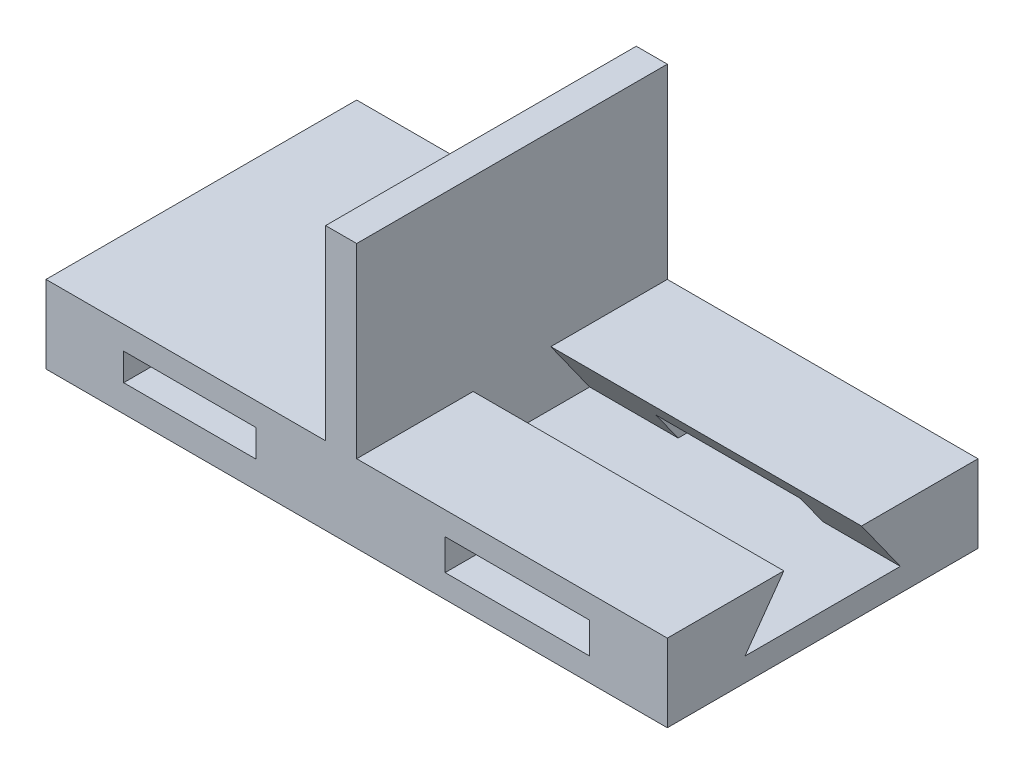
ISO-10303-21;
HEADER;
FILE_DESCRIPTION(('STEP AP214'),'2;1');
FILE_NAME('part.step','',(''),(''),'','','');
FILE_SCHEMA(('AUTOMOTIVE_DESIGN { 1 0 10303 214 1 1 1 1 }'));
ENDSEC;
DATA;
#1=APPLICATION_CONTEXT('core data for automotive mechanical design processes');
#2=APPLICATION_PROTOCOL_DEFINITION('international standard','automotive_design',2000,#1);
#3=PRODUCT_CONTEXT('',#1,'mechanical');
#4=PRODUCT('Part','Part','',(#3));
#5=PRODUCT_RELATED_PRODUCT_CATEGORY('part','',(#4));
#6=PRODUCT_DEFINITION_FORMATION('','',#4);
#7=PRODUCT_DEFINITION_CONTEXT('part definition',#1,'design');
#8=PRODUCT_DEFINITION('design','',#6,#7);
#9=PRODUCT_DEFINITION_SHAPE('','',#8);
#10=(LENGTH_UNIT() NAMED_UNIT(*) SI_UNIT(.MILLI.,.METRE.));
#11=(NAMED_UNIT(*) PLANE_ANGLE_UNIT() SI_UNIT($,.RADIAN.));
#12=(NAMED_UNIT(*) SI_UNIT($,.STERADIAN.) SOLID_ANGLE_UNIT());
#13=UNCERTAINTY_MEASURE_WITH_UNIT(LENGTH_MEASURE(1.E-05),#10,'distance_accuracy_value','');
#14=(GEOMETRIC_REPRESENTATION_CONTEXT(3) GLOBAL_UNCERTAINTY_ASSIGNED_CONTEXT((#13)) GLOBAL_UNIT_ASSIGNED_CONTEXT((#10,
#11,#12)) REPRESENTATION_CONTEXT('',''));
#15=CARTESIAN_POINT('',(0.,0.,0.));
#16=DIRECTION('',(0.,0.,1.));
#17=DIRECTION('',(1.,0.,0.));
#18=AXIS2_PLACEMENT_3D('',#15,#16,#17);
#19=CARTESIAN_POINT('',(-18.,-12.,0.));
#20=DIRECTION('',(0.,1.,0.));
#21=DIRECTION('',(0.,0.,1.));
#22=AXIS2_PLACEMENT_3D('',#19,#20,#21);
#23=PLANE('',#22);
#24=DIRECTION('',(1.,0.,0.));
#25=VECTOR('',#24,1.);
#26=CARTESIAN_POINT('',(2.,-12.,-12.5));
#27=LINE('',#26,#25);
#28=CARTESIAN_POINT('',(2.,-12.,-12.5));
#29=VERTEX_POINT('',#28);
#30=CARTESIAN_POINT('',(22.,-12.,-12.5));
#31=VERTEX_POINT('',#30);
#32=EDGE_CURVE('E325',#29,#31,#27,.T.);
#33=ORIENTED_EDGE('',*,*,#32,.T.);
#34=DIRECTION('',(0.,0.,1.));
#35=VECTOR('',#34,1.);
#36=CARTESIAN_POINT('',(22.,-12.,0.));
#37=LINE('',#36,#35);
#38=CARTESIAN_POINT('',(22.,-12.,-20.));
#39=VERTEX_POINT('',#38);
#40=EDGE_CURVE('E364',#39,#31,#37,.T.);
#41=ORIENTED_EDGE('',*,*,#40,.F.);
#42=DIRECTION('',(1.,0.,0.));
#43=VECTOR('',#42,1.);
#44=CARTESIAN_POINT('',(-18.,-12.,-20.));
#45=LINE('',#44,#43);
#46=CARTESIAN_POINT('',(2.,-12.,-20.));
#47=VERTEX_POINT('',#46);
#48=EDGE_CURVE('E394',#47,#39,#45,.T.);
#49=ORIENTED_EDGE('',*,*,#48,.F.);
#50=DIRECTION('',(0.,0.,-1.));
#51=VECTOR('',#50,1.);
#52=CARTESIAN_POINT('',(2.,-12.,0.));
#53=LINE('',#52,#51);
#54=EDGE_CURVE('E404',#29,#47,#53,.T.);
#55=ORIENTED_EDGE('',*,*,#54,.F.);
#56=EDGE_LOOP('',(#33,#41,#49,#55));
#57=FACE_BOUND('',#56,.T.);
#58=ADVANCED_FACE('F39',(#57),#23,.T.);
#59=CARTESIAN_POINT('',(2.,0.,0.));
#60=DIRECTION('',(0.,0.,-1.));
#61=DIRECTION('',(0.,1.,0.));
#62=AXIS2_PLACEMENT_3D('',#59,#60,#61);
#63=PLANE('',#62);
#64=DIRECTION('',(1.,0.,0.));
#65=VECTOR('',#64,1.);
#66=CARTESIAN_POINT('',(-4.48780006357861,-13.5,0.));
#67=LINE('',#66,#65);
#68=CARTESIAN_POINT('',(-13.,-13.5,0.));
#69=VERTEX_POINT('',#68);
#70=CARTESIAN_POINT('',(-4.48780006357861,-13.5,0.));
#71=VERTEX_POINT('',#70);
#72=EDGE_CURVE('E215',#69,#71,#67,.T.);
#73=ORIENTED_EDGE('',*,*,#72,.T.);
#74=DIRECTION('',(0.,-1.,0.));
#75=VECTOR('',#74,1.);
#76=CARTESIAN_POINT('',(-4.48780006357861,-13.5,0.));
#77=LINE('',#76,#75);
#78=CARTESIAN_POINT('',(-4.48780006357861,-15.261144814432,0.));
#79=VERTEX_POINT('',#78);
#80=EDGE_CURVE('E206',#71,#79,#77,.T.);
#81=ORIENTED_EDGE('',*,*,#80,.T.);
#82=DIRECTION('',(-1.,0.,0.));
#83=VECTOR('',#82,1.);
#84=CARTESIAN_POINT('',(-4.48780006357861,-15.261144814432,0.));
#85=LINE('',#84,#83);
#86=CARTESIAN_POINT('',(-13.,-15.261144814432,0.));
#87=VERTEX_POINT('',#86);
#88=EDGE_CURVE('E218',#79,#87,#85,.T.);
#89=ORIENTED_EDGE('',*,*,#88,.T.);
#90=DIRECTION('',(0.,1.,0.));
#91=VECTOR('',#90,1.);
#92=CARTESIAN_POINT('',(-13.,-13.5,0.));
#93=LINE('',#92,#91);
#94=EDGE_CURVE('E55',#87,#69,#93,.T.);
#95=ORIENTED_EDGE('',*,*,#94,.T.);
#96=EDGE_LOOP('',(#73,#81,#89,#95));
#97=FACE_BOUND('',#96,.T.);
#98=DIRECTION('',(-1.,0.,0.));
#99=VECTOR('',#98,1.);
#100=CARTESIAN_POINT('',(7.69528489708421,-15.5,0.));
#101=LINE('',#100,#99);
#102=CARTESIAN_POINT('',(17.,-15.5,0.));
#103=VERTEX_POINT('',#102);
#104=CARTESIAN_POINT('',(7.69528489708421,-15.5,0.));
#105=VERTEX_POINT('',#104);
#106=EDGE_CURVE('E266',#103,#105,#101,.T.);
#107=ORIENTED_EDGE('',*,*,#106,.T.);
#108=DIRECTION('',(0.,1.,0.));
#109=VECTOR('',#108,1.);
#110=CARTESIAN_POINT('',(7.69528489708421,-13.5,0.));
#111=LINE('',#110,#109);
#112=CARTESIAN_POINT('',(7.69528489708421,-13.5,0.));
#113=VERTEX_POINT('',#112);
#114=EDGE_CURVE('E255',#105,#113,#111,.T.);
#115=ORIENTED_EDGE('',*,*,#114,.T.);
#116=DIRECTION('',(1.,0.,0.));
#117=VECTOR('',#116,1.);
#118=CARTESIAN_POINT('',(7.69528489708421,-13.5,0.));
#119=LINE('',#118,#117);
#120=CARTESIAN_POINT('',(17.,-13.5,0.));
#121=VERTEX_POINT('',#120);
#122=EDGE_CURVE('E259',#113,#121,#119,.T.);
#123=ORIENTED_EDGE('',*,*,#122,.T.);
#124=DIRECTION('',(0.,-1.,0.));
#125=VECTOR('',#124,1.);
#126=CARTESIAN_POINT('',(17.,-13.5,0.));
#127=LINE('',#126,#125);
#128=EDGE_CURVE('E63',#121,#103,#127,.T.);
#129=ORIENTED_EDGE('',*,*,#128,.T.);
#130=EDGE_LOOP('',(#107,#115,#123,#129));
#131=FACE_BOUND('',#130,.T.);
#132=DIRECTION('',(0.,-1.,0.));
#133=VECTOR('',#132,1.);
#134=CARTESIAN_POINT('',(0.,0.,0.));
#135=LINE('',#134,#133);
#136=CARTESIAN_POINT('',(0.,0.,0.));
#137=VERTEX_POINT('',#136);
#138=CARTESIAN_POINT('',(0.,-12.,0.));
#139=VERTEX_POINT('',#138);
#140=EDGE_CURVE('E388',#137,#139,#135,.T.);
#141=ORIENTED_EDGE('',*,*,#140,.T.);
#142=DIRECTION('',(1.,0.,0.));
#143=VECTOR('',#142,1.);
#144=CARTESIAN_POINT('',(-18.,-12.,0.));
#145=LINE('',#144,#143);
#146=CARTESIAN_POINT('',(-18.,-12.,0.));
#147=VERTEX_POINT('',#146);
#148=EDGE_CURVE('E385',#147,#139,#145,.T.);
#149=ORIENTED_EDGE('',*,*,#148,.F.);
#150=DIRECTION('',(0.,-1.,0.));
#151=VECTOR('',#150,1.);
#152=CARTESIAN_POINT('',(-18.,-12.,0.));
#153=LINE('',#152,#151);
#154=CARTESIAN_POINT('',(-18.,-17.,0.));
#155=VERTEX_POINT('',#154);
#156=EDGE_CURVE('E368',#147,#155,#153,.T.);
#157=ORIENTED_EDGE('',*,*,#156,.T.);
#158=DIRECTION('',(1.,0.,0.));
#159=VECTOR('',#158,1.);
#160=CARTESIAN_POINT('',(-18.,-17.,0.));
#161=LINE('',#160,#159);
#162=CARTESIAN_POINT('',(22.,-17.,0.));
#163=VERTEX_POINT('',#162);
#164=EDGE_CURVE('E384',#155,#163,#161,.T.);
#165=ORIENTED_EDGE('',*,*,#164,.T.);
#166=DIRECTION('',(0.,-1.,0.));
#167=VECTOR('',#166,1.);
#168=CARTESIAN_POINT('',(22.,-12.,0.));
#169=LINE('',#168,#167);
#170=CARTESIAN_POINT('',(22.,-12.,0.));
#171=VERTEX_POINT('',#170);
#172=EDGE_CURVE('E339',#171,#163,#169,.T.);
#173=ORIENTED_EDGE('',*,*,#172,.F.);
#174=CARTESIAN_POINT('',(2.,-12.,0.));
#175=VERTEX_POINT('',#174);
#176=EDGE_CURVE('E389',#175,#171,#145,.T.);
#177=ORIENTED_EDGE('',*,*,#176,.F.);
#178=DIRECTION('',(0.,-1.,0.));
#179=VECTOR('',#178,1.);
#180=CARTESIAN_POINT('',(2.,0.,0.));
#181=LINE('',#180,#179);
#182=CARTESIAN_POINT('',(2.,0.,0.));
#183=VERTEX_POINT('',#182);
#184=EDGE_CURVE('E400',#183,#175,#181,.T.);
#185=ORIENTED_EDGE('',*,*,#184,.F.);
#186=DIRECTION('',(-1.,0.,0.));
#187=VECTOR('',#186,1.);
#188=CARTESIAN_POINT('',(2.,0.,0.));
#189=LINE('',#188,#187);
#190=EDGE_CURVE('E416',#183,#137,#189,.T.);
#191=ORIENTED_EDGE('',*,*,#190,.T.);
#192=EDGE_LOOP('',(#141,#149,#157,#165,#173,#177,#185,#191));
#193=FACE_BOUND('',#192,.T.);
#194=ADVANCED_FACE('F41',(#97,#131,#193),#63,.F.);
#195=CARTESIAN_POINT('',(2.,0.,-20.));
#196=DIRECTION('',(0.,0.,1.));
#197=DIRECTION('',(1.,0.,0.));
#198=AXIS2_PLACEMENT_3D('',#195,#196,#197);
#199=PLANE('',#198);
#200=DIRECTION('',(-1.,0.,0.));
#201=VECTOR('',#200,1.);
#202=CARTESIAN_POINT('',(-4.48780006357861,-15.261144814432,-20.));
#203=LINE('',#202,#201);
#204=CARTESIAN_POINT('',(-4.48780006357861,-15.261144814432,-20.));
#205=VERTEX_POINT('',#204);
#206=CARTESIAN_POINT('',(-13.,-15.261144814432,-20.));
#207=VERTEX_POINT('',#206);
#208=EDGE_CURVE('E239',#205,#207,#203,.T.);
#209=ORIENTED_EDGE('',*,*,#208,.F.);
#210=DIRECTION('',(0.,-1.,0.));
#211=VECTOR('',#210,1.);
#212=CARTESIAN_POINT('',(-4.48780006357861,-13.5,-20.));
#213=LINE('',#212,#211);
#214=CARTESIAN_POINT('',(-4.48780006357861,-13.5,-20.));
#215=VERTEX_POINT('',#214);
#216=EDGE_CURVE('E209',#215,#205,#213,.T.);
#217=ORIENTED_EDGE('',*,*,#216,.F.);
#218=DIRECTION('',(1.,0.,0.));
#219=VECTOR('',#218,1.);
#220=CARTESIAN_POINT('',(-4.48780006357861,-13.5,-20.));
#221=LINE('',#220,#219);
#222=CARTESIAN_POINT('',(-13.,-13.5,-20.));
#223=VERTEX_POINT('',#222);
#224=EDGE_CURVE('E226',#223,#215,#221,.T.);
#225=ORIENTED_EDGE('',*,*,#224,.F.);
#226=DIRECTION('',(0.,1.,0.));
#227=VECTOR('',#226,1.);
#228=CARTESIAN_POINT('',(-13.,-13.5,-20.));
#229=LINE('',#228,#227);
#230=EDGE_CURVE('E230',#207,#223,#229,.T.);
#231=ORIENTED_EDGE('',*,*,#230,.F.);
#232=EDGE_LOOP('',(#209,#217,#225,#231));
#233=FACE_BOUND('',#232,.T.);
#234=DIRECTION('',(1.,0.,0.));
#235=VECTOR('',#234,1.);
#236=CARTESIAN_POINT('',(7.69528489708421,-13.5,-20.));
#237=LINE('',#236,#235);
#238=CARTESIAN_POINT('',(7.69528489708421,-13.5,-20.));
#239=VERTEX_POINT('',#238);
#240=CARTESIAN_POINT('',(17.,-13.5,-20.));
#241=VERTEX_POINT('',#240);
#242=EDGE_CURVE('E274',#239,#241,#237,.T.);
#243=ORIENTED_EDGE('',*,*,#242,.F.);
#244=DIRECTION('',(0.,1.,0.));
#245=VECTOR('',#244,1.);
#246=CARTESIAN_POINT('',(7.69528489708421,-13.5,-20.));
#247=LINE('',#246,#245);
#248=CARTESIAN_POINT('',(7.69528489708421,-15.5,-20.));
#249=VERTEX_POINT('',#248);
#250=EDGE_CURVE('E271',#249,#239,#247,.T.);
#251=ORIENTED_EDGE('',*,*,#250,.F.);
#252=DIRECTION('',(-1.,0.,0.));
#253=VECTOR('',#252,1.);
#254=CARTESIAN_POINT('',(7.69528489708421,-15.5,-20.));
#255=LINE('',#254,#253);
#256=CARTESIAN_POINT('',(17.,-15.5,-20.));
#257=VERTEX_POINT('',#256);
#258=EDGE_CURVE('E260',#257,#249,#255,.T.);
#259=ORIENTED_EDGE('',*,*,#258,.F.);
#260=DIRECTION('',(0.,-1.,0.));
#261=VECTOR('',#260,1.);
#262=CARTESIAN_POINT('',(17.,-13.5,-20.));
#263=LINE('',#262,#261);
#264=EDGE_CURVE('E278',#241,#257,#263,.T.);
#265=ORIENTED_EDGE('',*,*,#264,.F.);
#266=EDGE_LOOP('',(#243,#251,#259,#265));
#267=FACE_BOUND('',#266,.T.);
#268=DIRECTION('',(0.,1.,0.));
#269=VECTOR('',#268,1.);
#270=CARTESIAN_POINT('',(0.,0.,-20.));
#271=LINE('',#270,#269);
#272=CARTESIAN_POINT('',(0.,-12.,-20.));
#273=VERTEX_POINT('',#272);
#274=CARTESIAN_POINT('',(0.,0.,-20.));
#275=VERTEX_POINT('',#274);
#276=EDGE_CURVE('E423',#273,#275,#271,.T.);
#277=ORIENTED_EDGE('',*,*,#276,.T.);
#278=DIRECTION('',(-1.,0.,0.));
#279=VECTOR('',#278,1.);
#280=CARTESIAN_POINT('',(2.,0.,-20.));
#281=LINE('',#280,#279);
#282=CARTESIAN_POINT('',(2.,0.,-20.));
#283=VERTEX_POINT('',#282);
#284=EDGE_CURVE('E431',#283,#275,#281,.T.);
#285=ORIENTED_EDGE('',*,*,#284,.F.);
#286=DIRECTION('',(0.,1.,0.));
#287=VECTOR('',#286,1.);
#288=CARTESIAN_POINT('',(2.,0.,-20.));
#289=LINE('',#288,#287);
#290=EDGE_CURVE('E410',#47,#283,#289,.T.);
#291=ORIENTED_EDGE('',*,*,#290,.F.);
#292=ORIENTED_EDGE('',*,*,#48,.T.);
#293=DIRECTION('',(0.,1.,0.));
#294=VECTOR('',#293,1.);
#295=CARTESIAN_POINT('',(22.,-12.,-20.));
#296=LINE('',#295,#294);
#297=CARTESIAN_POINT('',(22.,-17.,-20.));
#298=VERTEX_POINT('',#297);
#299=EDGE_CURVE('E359',#298,#39,#296,.T.);
#300=ORIENTED_EDGE('',*,*,#299,.F.);
#301=DIRECTION('',(1.,0.,0.));
#302=VECTOR('',#301,1.);
#303=CARTESIAN_POINT('',(-18.,-17.,-20.));
#304=LINE('',#303,#302);
#305=CARTESIAN_POINT('',(-18.,-17.,-20.));
#306=VERTEX_POINT('',#305);
#307=EDGE_CURVE('E395',#306,#298,#304,.T.);
#308=ORIENTED_EDGE('',*,*,#307,.F.);
#309=DIRECTION('',(0.,1.,0.));
#310=VECTOR('',#309,1.);
#311=CARTESIAN_POINT('',(-18.,-12.,-20.));
#312=LINE('',#311,#310);
#313=CARTESIAN_POINT('',(-18.,-12.,-20.));
#314=VERTEX_POINT('',#313);
#315=EDGE_CURVE('E376',#306,#314,#312,.T.);
#316=ORIENTED_EDGE('',*,*,#315,.T.);
#317=EDGE_CURVE('E390',#314,#273,#45,.T.);
#318=ORIENTED_EDGE('',*,*,#317,.T.);
#319=EDGE_LOOP('',(#277,#285,#291,#292,#300,#308,#316,#318));
#320=FACE_BOUND('',#319,.T.);
#321=ADVANCED_FACE('F500',(#233,#267,#320),#199,.F.);
#322=CARTESIAN_POINT('',(2.,0.,0.));
#323=DIRECTION('',(0.,-1.,0.));
#324=DIRECTION('',(0.,0.,-1.));
#325=AXIS2_PLACEMENT_3D('',#322,#323,#324);
#326=PLANE('',#325);
#327=DIRECTION('',(0.,0.,1.));
#328=VECTOR('',#327,1.);
#329=CARTESIAN_POINT('',(0.,0.,0.));
#330=LINE('',#329,#328);
#331=EDGE_CURVE('E405',#275,#137,#330,.T.);
#332=ORIENTED_EDGE('',*,*,#331,.T.);
#333=ORIENTED_EDGE('',*,*,#190,.F.);
#334=DIRECTION('',(0.,0.,1.));
#335=VECTOR('',#334,1.);
#336=CARTESIAN_POINT('',(2.,0.,0.));
#337=LINE('',#336,#335);
#338=EDGE_CURVE('E413',#283,#183,#337,.T.);
#339=ORIENTED_EDGE('',*,*,#338,.F.);
#340=ORIENTED_EDGE('',*,*,#284,.T.);
#341=EDGE_LOOP('',(#332,#333,#339,#340));
#342=FACE_BOUND('',#341,.T.);
#343=ADVANCED_FACE('F543',(#342),#326,.F.);
#344=CARTESIAN_POINT('',(2.,0.,0.));
#345=DIRECTION('',(1.,0.,0.));
#346=DIRECTION('',(0.,0.,-1.));
#347=AXIS2_PLACEMENT_3D('',#344,#345,#346);
#348=PLANE('',#347);
#349=ORIENTED_EDGE('',*,*,#184,.T.);
#350=CARTESIAN_POINT('',(2.,-12.,-7.5));
#351=VERTEX_POINT('',#350);
#352=EDGE_CURVE('E406',#175,#351,#53,.T.);
#353=ORIENTED_EDGE('',*,*,#352,.T.);
#354=DIRECTION('',(0.,-0.813733471206735,0.581238193719097));
#355=VECTOR('',#354,1.);
#356=CARTESIAN_POINT('',(2.,-12.,-7.5));
#357=LINE('',#356,#355);
#358=CARTESIAN_POINT('',(2.,-15.5,-5.));
#359=VERTEX_POINT('',#358);
#360=EDGE_CURVE('E316',#351,#359,#357,.T.);
#361=ORIENTED_EDGE('',*,*,#360,.T.);
#362=DIRECTION('',(0.,0.,-1.));
#363=VECTOR('',#362,1.);
#364=CARTESIAN_POINT('',(2.,-15.5,-5.));
#365=LINE('',#364,#363);
#366=CARTESIAN_POINT('',(2.,-15.5,-15.));
#367=VERTEX_POINT('',#366);
#368=EDGE_CURVE('E321',#359,#367,#365,.T.);
#369=ORIENTED_EDGE('',*,*,#368,.T.);
#370=DIRECTION('',(0.,0.813733471206735,0.581238193719096));
#371=VECTOR('',#370,1.);
#372=CARTESIAN_POINT('',(2.,-15.5,-15.));
#373=LINE('',#372,#371);
#374=EDGE_CURVE('E312',#367,#29,#373,.T.);
#375=ORIENTED_EDGE('',*,*,#374,.T.);
#376=ORIENTED_EDGE('',*,*,#54,.T.);
#377=ORIENTED_EDGE('',*,*,#290,.T.);
#378=ORIENTED_EDGE('',*,*,#338,.T.);
#379=EDGE_LOOP('',(#349,#353,#361,#369,#375,#376,#377,#378));
#380=FACE_BOUND('',#379,.T.);
#381=ADVANCED_FACE('F460',(#380),#348,.T.);
#382=CARTESIAN_POINT('',(0.,0.,0.));
#383=DIRECTION('',(1.,0.,0.));
#384=DIRECTION('',(0.,0.,-1.));
#385=AXIS2_PLACEMENT_3D('',#382,#383,#384);
#386=PLANE('',#385);
#387=ORIENTED_EDGE('',*,*,#140,.F.);
#388=ORIENTED_EDGE('',*,*,#331,.F.);
#389=ORIENTED_EDGE('',*,*,#276,.F.);
#390=DIRECTION('',(0.,0.,-1.));
#391=VECTOR('',#390,1.);
#392=CARTESIAN_POINT('',(0.,-12.,0.));
#393=LINE('',#392,#391);
#394=EDGE_CURVE('E420',#139,#273,#393,.T.);
#395=ORIENTED_EDGE('',*,*,#394,.F.);
#396=EDGE_LOOP('',(#387,#388,#389,#395));
#397=FACE_BOUND('',#396,.T.);
#398=ADVANCED_FACE('F523',(#397),#386,.F.);
#399=DIRECTION('',(1.,0.,0.));
#400=VECTOR('',#399,1.);
#401=CARTESIAN_POINT('',(2.,-12.,-7.5));
#402=LINE('',#401,#400);
#403=CARTESIAN_POINT('',(22.,-12.,-7.5));
#404=VERTEX_POINT('',#403);
#405=EDGE_CURVE('E346',#351,#404,#402,.T.);
#406=ORIENTED_EDGE('',*,*,#405,.F.);
#407=ORIENTED_EDGE('',*,*,#352,.F.);
#408=ORIENTED_EDGE('',*,*,#176,.T.);
#409=EDGE_CURVE('E363',#404,#171,#37,.T.);
#410=ORIENTED_EDGE('',*,*,#409,.F.);
#411=EDGE_LOOP('',(#406,#407,#408,#410));
#412=FACE_BOUND('',#411,.T.);
#413=ADVANCED_FACE('F466',(#412),#23,.T.);
#414=ORIENTED_EDGE('',*,*,#148,.T.);
#415=ORIENTED_EDGE('',*,*,#394,.T.);
#416=ORIENTED_EDGE('',*,*,#317,.F.);
#417=DIRECTION('',(0.,0.,1.));
#418=VECTOR('',#417,1.);
#419=CARTESIAN_POINT('',(-18.,-12.,0.));
#420=LINE('',#419,#418);
#421=EDGE_CURVE('E380',#314,#147,#420,.T.);
#422=ORIENTED_EDGE('',*,*,#421,.T.);
#423=EDGE_LOOP('',(#414,#415,#416,#422));
#424=FACE_BOUND('',#423,.T.);
#425=ADVANCED_FACE('F516',(#424),#23,.T.);
#426=CARTESIAN_POINT('',(-18.,-17.,0.));
#427=DIRECTION('',(0.,-1.,0.));
#428=DIRECTION('',(0.,0.,-1.));
#429=AXIS2_PLACEMENT_3D('',#426,#427,#428);
#430=PLANE('',#429);
#431=ORIENTED_EDGE('',*,*,#307,.T.);
#432=DIRECTION('',(0.,0.,-1.));
#433=VECTOR('',#432,1.);
#434=CARTESIAN_POINT('',(22.,-17.,0.));
#435=LINE('',#434,#433);
#436=EDGE_CURVE('E355',#163,#298,#435,.T.);
#437=ORIENTED_EDGE('',*,*,#436,.F.);
#438=ORIENTED_EDGE('',*,*,#164,.F.);
#439=DIRECTION('',(0.,0.,-1.));
#440=VECTOR('',#439,1.);
#441=CARTESIAN_POINT('',(-18.,-17.,0.));
#442=LINE('',#441,#440);
#443=EDGE_CURVE('E372',#155,#306,#442,.T.);
#444=ORIENTED_EDGE('',*,*,#443,.T.);
#445=EDGE_LOOP('',(#431,#437,#438,#444));
#446=FACE_BOUND('',#445,.T.);
#447=ADVANCED_FACE('F525',(#446),#430,.T.);
#448=CARTESIAN_POINT('',(-18.,0.,0.));
#449=DIRECTION('',(1.,0.,0.));
#450=DIRECTION('',(0.,0.,-1.));
#451=AXIS2_PLACEMENT_3D('',#448,#449,#450);
#452=PLANE('',#451);
#453=ORIENTED_EDGE('',*,*,#156,.F.);
#454=ORIENTED_EDGE('',*,*,#421,.F.);
#455=ORIENTED_EDGE('',*,*,#315,.F.);
#456=ORIENTED_EDGE('',*,*,#443,.F.);
#457=EDGE_LOOP('',(#453,#454,#455,#456));
#458=FACE_BOUND('',#457,.T.);
#459=ADVANCED_FACE('F530',(#458),#452,.F.);
#460=CARTESIAN_POINT('',(22.,0.,0.));
#461=DIRECTION('',(1.,0.,0.));
#462=DIRECTION('',(0.,0.,-1.));
#463=AXIS2_PLACEMENT_3D('',#460,#461,#462);
#464=PLANE('',#463);
#465=DIRECTION('',(0.,0.813733471206735,0.581238193719096));
#466=VECTOR('',#465,1.);
#467=CARTESIAN_POINT('',(22.,-15.5,-15.));
#468=LINE('',#467,#466);
#469=CARTESIAN_POINT('',(22.,-15.5,-15.));
#470=VERTEX_POINT('',#469);
#471=EDGE_CURVE('E311',#470,#31,#468,.T.);
#472=ORIENTED_EDGE('',*,*,#471,.F.);
#473=DIRECTION('',(0.,0.,-1.));
#474=VECTOR('',#473,1.);
#475=CARTESIAN_POINT('',(22.,-15.5,-5.));
#476=LINE('',#475,#474);
#477=CARTESIAN_POINT('',(22.,-15.5,-5.));
#478=VERTEX_POINT('',#477);
#479=EDGE_CURVE('E317',#478,#470,#476,.T.);
#480=ORIENTED_EDGE('',*,*,#479,.F.);
#481=DIRECTION('',(0.,-0.813733471206735,0.581238193719097));
#482=VECTOR('',#481,1.);
#483=CARTESIAN_POINT('',(22.,-12.,-7.5));
#484=LINE('',#483,#482);
#485=EDGE_CURVE('E328',#404,#478,#484,.T.);
#486=ORIENTED_EDGE('',*,*,#485,.F.);
#487=ORIENTED_EDGE('',*,*,#409,.T.);
#488=ORIENTED_EDGE('',*,*,#172,.T.);
#489=ORIENTED_EDGE('',*,*,#436,.T.);
#490=ORIENTED_EDGE('',*,*,#299,.T.);
#491=ORIENTED_EDGE('',*,*,#40,.T.);
#492=EDGE_LOOP('',(#472,#480,#486,#487,#488,#489,#490,#491));
#493=FACE_BOUND('',#492,.T.);
#494=ADVANCED_FACE('F479',(#493),#464,.T.);
#495=CARTESIAN_POINT('',(2.,-15.5,-15.));
#496=DIRECTION('',(0.,0.581238193719096,-0.813733471206735));
#497=DIRECTION('',(0.,0.813733471206735,0.581238193719096));
#498=AXIS2_PLACEMENT_3D('',#495,#496,#497);
#499=PLANE('',#498);
#500=DIRECTION('',(1.,0.,0.));
#501=VECTOR('',#500,1.);
#502=CARTESIAN_POINT('',(2.,-15.5,-15.));
#503=LINE('',#502,#501);
#504=CARTESIAN_POINT('',(7.69528489708421,-15.5,-15.));
#505=VERTEX_POINT('',#504);
#506=EDGE_CURVE('E335',#367,#505,#503,.T.);
#507=ORIENTED_EDGE('',*,*,#506,.T.);
#508=DIRECTION('',(0.,0.813733471206735,0.581238193719096));
#509=VECTOR('',#508,1.);
#510=CARTESIAN_POINT('',(7.69528489708421,-15.5,-15.));
#511=LINE('',#510,#509);
#512=CARTESIAN_POINT('',(7.69528489708421,-13.5,-13.5714285714286));
#513=VERTEX_POINT('',#512);
#514=EDGE_CURVE('E307',#505,#513,#511,.T.);
#515=ORIENTED_EDGE('',*,*,#514,.T.);
#516=DIRECTION('',(1.,0.,0.));
#517=VECTOR('',#516,1.);
#518=CARTESIAN_POINT('',(2.,-13.5,-13.5714285714286));
#519=LINE('',#518,#517);
#520=CARTESIAN_POINT('',(17.,-13.5,-13.5714285714286));
#521=VERTEX_POINT('',#520);
#522=EDGE_CURVE('E249',#513,#521,#519,.T.);
#523=ORIENTED_EDGE('',*,*,#522,.T.);
#524=DIRECTION('',(0.,-0.813733471206735,-0.581238193719096));
#525=VECTOR('',#524,1.);
#526=CARTESIAN_POINT('',(17.,-15.5,-15.));
#527=LINE('',#526,#525);
#528=CARTESIAN_POINT('',(17.,-15.5,-15.));
#529=VERTEX_POINT('',#528);
#530=EDGE_CURVE('E303',#521,#529,#527,.T.);
#531=ORIENTED_EDGE('',*,*,#530,.T.);
#532=EDGE_CURVE('E340',#529,#470,#503,.T.);
#533=ORIENTED_EDGE('',*,*,#532,.T.);
#534=ORIENTED_EDGE('',*,*,#471,.T.);
#535=ORIENTED_EDGE('',*,*,#32,.F.);
#536=ORIENTED_EDGE('',*,*,#374,.F.);
#537=EDGE_LOOP('',(#507,#515,#523,#531,#533,#534,#535,#536));
#538=FACE_BOUND('',#537,.T.);
#539=ADVANCED_FACE('F475',(#538),#499,.F.);
#540=CARTESIAN_POINT('',(2.,-15.5,-5.));
#541=DIRECTION('',(0.,-1.,0.));
#542=DIRECTION('',(0.,0.,-1.));
#543=AXIS2_PLACEMENT_3D('',#540,#541,#542);
#544=PLANE('',#543);
#545=ORIENTED_EDGE('',*,*,#532,.F.);
#546=DIRECTION('',(0.,0.,-1.));
#547=VECTOR('',#546,1.);
#548=CARTESIAN_POINT('',(17.,-15.5,0.));
#549=LINE('',#548,#547);
#550=EDGE_CURVE('E292',#529,#257,#549,.T.);
#551=ORIENTED_EDGE('',*,*,#550,.T.);
#552=ORIENTED_EDGE('',*,*,#258,.T.);
#553=DIRECTION('',(0.,0.,-1.));
#554=VECTOR('',#553,1.);
#555=CARTESIAN_POINT('',(7.69528489708421,-15.5,0.));
#556=LINE('',#555,#554);
#557=EDGE_CURVE('E287',#505,#249,#556,.T.);
#558=ORIENTED_EDGE('',*,*,#557,.F.);
#559=ORIENTED_EDGE('',*,*,#506,.F.);
#560=ORIENTED_EDGE('',*,*,#368,.F.);
#561=DIRECTION('',(1.,0.,0.));
#562=VECTOR('',#561,1.);
#563=CARTESIAN_POINT('',(2.,-15.5,-5.));
#564=LINE('',#563,#562);
#565=CARTESIAN_POINT('',(7.69528489708421,-15.5,-5.));
#566=VERTEX_POINT('',#565);
#567=EDGE_CURVE('E341',#359,#566,#564,.T.);
#568=ORIENTED_EDGE('',*,*,#567,.T.);
#569=EDGE_CURVE('E240',#105,#566,#556,.T.);
#570=ORIENTED_EDGE('',*,*,#569,.F.);
#571=ORIENTED_EDGE('',*,*,#106,.F.);
#572=CARTESIAN_POINT('',(17.,-15.5,-5.));
#573=VERTEX_POINT('',#572);
#574=EDGE_CURVE('E288',#103,#573,#549,.T.);
#575=ORIENTED_EDGE('',*,*,#574,.T.);
#576=EDGE_CURVE('E345',#573,#478,#564,.T.);
#577=ORIENTED_EDGE('',*,*,#576,.T.);
#578=ORIENTED_EDGE('',*,*,#479,.T.);
#579=EDGE_LOOP('',(#545,#551,#552,#558,#559,#560,#568,#570,#571,#575,#577,#578));
#580=FACE_BOUND('',#579,.T.);
#581=ADVANCED_FACE('F447',(#580),#544,.F.);
#582=CARTESIAN_POINT('',(2.,-12.,-7.5));
#583=DIRECTION('',(0.,0.581238193719097,0.813733471206735));
#584=DIRECTION('',(0.,-0.813733471206735,0.581238193719097));
#585=AXIS2_PLACEMENT_3D('',#582,#583,#584);
#586=PLANE('',#585);
#587=DIRECTION('',(-1.,0.,0.));
#588=VECTOR('',#587,1.);
#589=CARTESIAN_POINT('',(2.,-13.5,-6.42857142857143));
#590=LINE('',#589,#588);
#591=CARTESIAN_POINT('',(17.,-13.5,-6.42857142857143));
#592=VERTEX_POINT('',#591);
#593=CARTESIAN_POINT('',(7.69528489708421,-13.5,-6.42857142857143));
#594=VERTEX_POINT('',#593);
#595=EDGE_CURVE('E435',#592,#594,#590,.T.);
#596=ORIENTED_EDGE('',*,*,#595,.T.);
#597=DIRECTION('',(0.,-0.813733471206735,0.581238193719097));
#598=VECTOR('',#597,1.);
#599=CARTESIAN_POINT('',(7.69528489708421,-12.,-7.5));
#600=LINE('',#599,#598);
#601=EDGE_CURVE('E11',#594,#566,#600,.T.);
#602=ORIENTED_EDGE('',*,*,#601,.T.);
#603=ORIENTED_EDGE('',*,*,#567,.F.);
#604=ORIENTED_EDGE('',*,*,#360,.F.);
#605=ORIENTED_EDGE('',*,*,#405,.T.);
#606=ORIENTED_EDGE('',*,*,#485,.T.);
#607=ORIENTED_EDGE('',*,*,#576,.F.);
#608=DIRECTION('',(0.,0.813733471206735,-0.581238193719097));
#609=VECTOR('',#608,1.);
#610=CARTESIAN_POINT('',(17.,-12.,-7.5));
#611=LINE('',#610,#609);
#612=EDGE_CURVE('E48',#573,#592,#611,.T.);
#613=ORIENTED_EDGE('',*,*,#612,.T.);
#614=EDGE_LOOP('',(#596,#602,#603,#604,#605,#606,#607,#613));
#615=FACE_BOUND('',#614,.T.);
#616=ADVANCED_FACE('F442',(#615),#586,.F.);
#617=CARTESIAN_POINT('',(7.69528489708421,-13.5,0.));
#618=DIRECTION('',(0.,1.,0.));
#619=DIRECTION('',(-1.,0.,0.));
#620=AXIS2_PLACEMENT_3D('',#617,#618,#619);
#621=PLANE('',#620);
#622=DIRECTION('',(0.,0.,-1.));
#623=VECTOR('',#622,1.);
#624=CARTESIAN_POINT('',(17.,-13.5,0.));
#625=LINE('',#624,#623);
#626=EDGE_CURVE('E293',#121,#592,#625,.T.);
#627=ORIENTED_EDGE('',*,*,#626,.F.);
#628=ORIENTED_EDGE('',*,*,#122,.F.);
#629=DIRECTION('',(0.,0.,-1.));
#630=VECTOR('',#629,1.);
#631=CARTESIAN_POINT('',(7.69528489708421,-13.5,0.));
#632=LINE('',#631,#630);
#633=EDGE_CURVE('E297',#113,#594,#632,.T.);
#634=ORIENTED_EDGE('',*,*,#633,.T.);
#635=ORIENTED_EDGE('',*,*,#595,.F.);
#636=EDGE_LOOP('',(#627,#628,#634,#635));
#637=FACE_BOUND('',#636,.T.);
#638=ADVANCED_FACE('F452',(#637),#621,.F.);
#639=CARTESIAN_POINT('',(17.,-13.5,0.));
#640=DIRECTION('',(1.,0.,0.));
#641=DIRECTION('',(0.,0.,-1.));
#642=AXIS2_PLACEMENT_3D('',#639,#640,#641);
#643=PLANE('',#642);
#644=ORIENTED_EDGE('',*,*,#574,.F.);
#645=ORIENTED_EDGE('',*,*,#128,.F.);
#646=ORIENTED_EDGE('',*,*,#626,.T.);
#647=ORIENTED_EDGE('',*,*,#612,.F.);
#648=EDGE_LOOP('',(#644,#645,#646,#647));
#649=FACE_BOUND('',#648,.T.);
#650=ADVANCED_FACE('F443',(#649),#643,.F.);
#651=CARTESIAN_POINT('',(7.69528489708421,-13.5,0.));
#652=DIRECTION('',(-1.,0.,0.));
#653=DIRECTION('',(0.,0.,1.));
#654=AXIS2_PLACEMENT_3D('',#651,#652,#653);
#655=PLANE('',#654);
#656=ORIENTED_EDGE('',*,*,#633,.F.);
#657=ORIENTED_EDGE('',*,*,#114,.F.);
#658=ORIENTED_EDGE('',*,*,#569,.T.);
#659=ORIENTED_EDGE('',*,*,#601,.F.);
#660=EDGE_LOOP('',(#656,#657,#658,#659));
#661=FACE_BOUND('',#660,.T.);
#662=ADVANCED_FACE('F455',(#661),#655,.F.);
#663=ORIENTED_EDGE('',*,*,#557,.T.);
#664=ORIENTED_EDGE('',*,*,#250,.T.);
#665=EDGE_CURVE('E270',#513,#239,#632,.T.);
#666=ORIENTED_EDGE('',*,*,#665,.F.);
#667=ORIENTED_EDGE('',*,*,#514,.F.);
#668=EDGE_LOOP('',(#663,#664,#666,#667));
#669=FACE_BOUND('',#668,.T.);
#670=ADVANCED_FACE('F487',(#669),#655,.F.);
#671=EDGE_CURVE('E296',#521,#241,#625,.T.);
#672=ORIENTED_EDGE('',*,*,#671,.T.);
#673=ORIENTED_EDGE('',*,*,#264,.T.);
#674=ORIENTED_EDGE('',*,*,#550,.F.);
#675=ORIENTED_EDGE('',*,*,#530,.F.);
#676=EDGE_LOOP('',(#672,#673,#674,#675));
#677=FACE_BOUND('',#676,.T.);
#678=ADVANCED_FACE('F503',(#677),#643,.F.);
#679=ORIENTED_EDGE('',*,*,#665,.T.);
#680=ORIENTED_EDGE('',*,*,#242,.T.);
#681=ORIENTED_EDGE('',*,*,#671,.F.);
#682=ORIENTED_EDGE('',*,*,#522,.F.);
#683=EDGE_LOOP('',(#679,#680,#681,#682));
#684=FACE_BOUND('',#683,.T.);
#685=ADVANCED_FACE('F497',(#684),#621,.F.);
#686=CARTESIAN_POINT('',(-4.48780006357861,-13.5,0.));
#687=DIRECTION('',(1.,0.,0.));
#688=DIRECTION('',(0.,0.,-1.));
#689=AXIS2_PLACEMENT_3D('',#686,#687,#688);
#690=PLANE('',#689);
#691=ORIENTED_EDGE('',*,*,#216,.T.);
#692=DIRECTION('',(0.,0.,-1.));
#693=VECTOR('',#692,1.);
#694=CARTESIAN_POINT('',(-4.48780006357861,-15.261144814432,0.));
#695=LINE('',#694,#693);
#696=EDGE_CURVE('E202',#79,#205,#695,.T.);
#697=ORIENTED_EDGE('',*,*,#696,.F.);
#698=ORIENTED_EDGE('',*,*,#80,.F.);
#699=DIRECTION('',(0.,0.,-1.));
#700=VECTOR('',#699,1.);
#701=CARTESIAN_POINT('',(-4.48780006357861,-13.5,0.));
#702=LINE('',#701,#700);
#703=EDGE_CURVE('E246',#71,#215,#702,.T.);
#704=ORIENTED_EDGE('',*,*,#703,.T.);
#705=EDGE_LOOP('',(#691,#697,#698,#704));
#706=FACE_BOUND('',#705,.T.);
#707=ADVANCED_FACE('F204',(#706),#690,.F.);
#708=CARTESIAN_POINT('',(-4.48780006357861,-13.5,0.));
#709=DIRECTION('',(0.,1.,0.));
#710=DIRECTION('',(0.,0.,1.));
#711=AXIS2_PLACEMENT_3D('',#708,#709,#710);
#712=PLANE('',#711);
#713=ORIENTED_EDGE('',*,*,#224,.T.);
#714=ORIENTED_EDGE('',*,*,#703,.F.);
#715=ORIENTED_EDGE('',*,*,#72,.F.);
#716=DIRECTION('',(0.,0.,-1.));
#717=VECTOR('',#716,1.);
#718=CARTESIAN_POINT('',(-13.,-13.5,0.));
#719=LINE('',#718,#717);
#720=EDGE_CURVE('E250',#69,#223,#719,.T.);
#721=ORIENTED_EDGE('',*,*,#720,.T.);
#722=EDGE_LOOP('',(#713,#714,#715,#721));
#723=FACE_BOUND('',#722,.T.);
#724=ADVANCED_FACE('F608',(#723),#712,.F.);
#725=CARTESIAN_POINT('',(-13.,-13.5,0.));
#726=DIRECTION('',(-1.,0.,0.));
#727=DIRECTION('',(0.,0.,1.));
#728=AXIS2_PLACEMENT_3D('',#725,#726,#727);
#729=PLANE('',#728);
#730=ORIENTED_EDGE('',*,*,#230,.T.);
#731=ORIENTED_EDGE('',*,*,#720,.F.);
#732=ORIENTED_EDGE('',*,*,#94,.F.);
#733=DIRECTION('',(0.,0.,-1.));
#734=VECTOR('',#733,1.);
#735=CARTESIAN_POINT('',(-13.,-15.261144814432,0.));
#736=LINE('',#735,#734);
#737=EDGE_CURVE('E214',#87,#207,#736,.T.);
#738=ORIENTED_EDGE('',*,*,#737,.T.);
#739=EDGE_LOOP('',(#730,#731,#732,#738));
#740=FACE_BOUND('',#739,.T.);
#741=ADVANCED_FACE('F616',(#740),#729,.F.);
#742=CARTESIAN_POINT('',(-4.48780006357861,-15.261144814432,0.));
#743=DIRECTION('',(0.,-1.,0.));
#744=DIRECTION('',(0.,0.,-1.));
#745=AXIS2_PLACEMENT_3D('',#742,#743,#744);
#746=PLANE('',#745);
#747=ORIENTED_EDGE('',*,*,#208,.T.);
#748=ORIENTED_EDGE('',*,*,#737,.F.);
#749=ORIENTED_EDGE('',*,*,#88,.F.);
#750=ORIENTED_EDGE('',*,*,#696,.T.);
#751=EDGE_LOOP('',(#747,#748,#749,#750));
#752=FACE_BOUND('',#751,.T.);
#753=ADVANCED_FACE('F219',(#752),#746,.F.);
#754=CLOSED_SHELL('',(#58,#194,#321,#343,#381,#398,#413,#425,#447,#459,#494,#539,#581,#616,#638,
#650,#662,#670,#678,#685,#707,#724,#741,#753));
#755=MANIFOLD_SOLID_BREP('B2',#754);
#756=ADVANCED_BREP_SHAPE_REPRESENTATION('',(#18,#755),#14);
#757=SHAPE_DEFINITION_REPRESENTATION(#9,#756);
ENDSEC;
END-ISO-10303-21;
